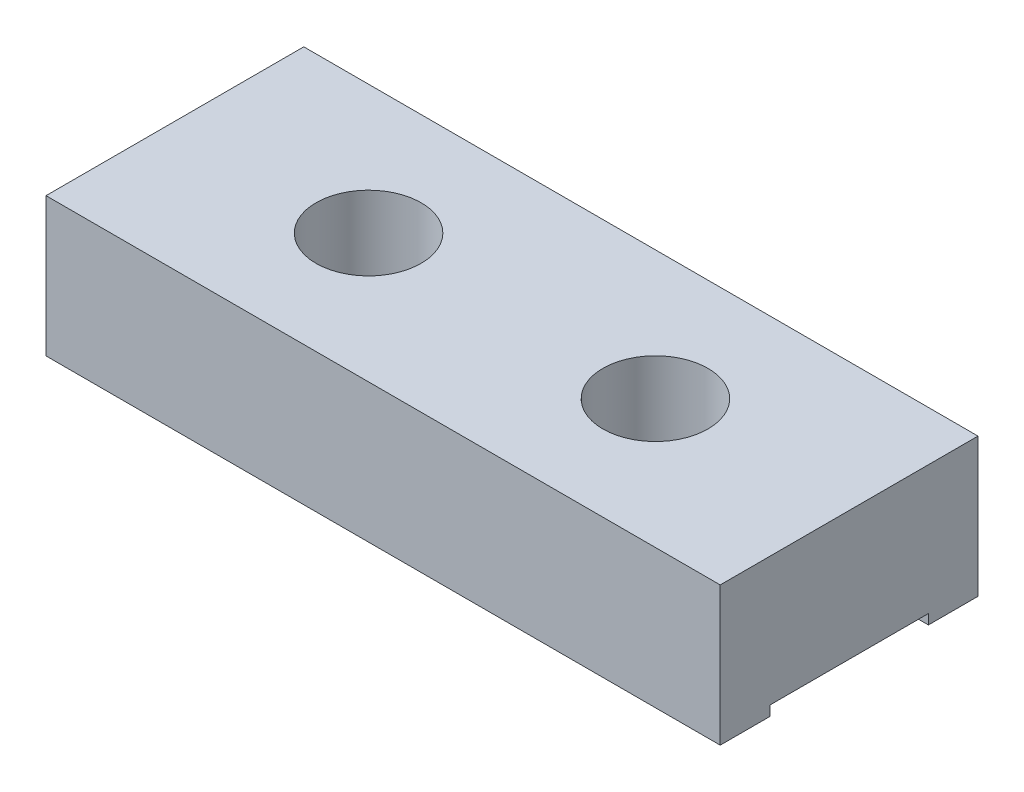
ISO-10303-21;
HEADER;
FILE_DESCRIPTION(('STEP AP214'),'2;1');
FILE_NAME('part.step','',(''),(''),'','','');
FILE_SCHEMA(('AUTOMOTIVE_DESIGN { 1 0 10303 214 1 1 1 1 }'));
ENDSEC;
DATA;
#1=APPLICATION_CONTEXT('core data for automotive mechanical design processes');
#2=APPLICATION_PROTOCOL_DEFINITION('international standard','automotive_design',2000,#1);
#3=PRODUCT_CONTEXT('',#1,'mechanical');
#4=PRODUCT('Part','Part','',(#3));
#5=PRODUCT_RELATED_PRODUCT_CATEGORY('part','',(#4));
#6=PRODUCT_DEFINITION_FORMATION('','',#4);
#7=PRODUCT_DEFINITION_CONTEXT('part definition',#1,'design');
#8=PRODUCT_DEFINITION('design','',#6,#7);
#9=PRODUCT_DEFINITION_SHAPE('','',#8);
#10=(LENGTH_UNIT() NAMED_UNIT(*) SI_UNIT(.MILLI.,.METRE.));
#11=(NAMED_UNIT(*) PLANE_ANGLE_UNIT() SI_UNIT($,.RADIAN.));
#12=(NAMED_UNIT(*) SI_UNIT($,.STERADIAN.) SOLID_ANGLE_UNIT());
#13=UNCERTAINTY_MEASURE_WITH_UNIT(LENGTH_MEASURE(1.E-05),#10,'distance_accuracy_value','');
#14=(GEOMETRIC_REPRESENTATION_CONTEXT(3) GLOBAL_UNCERTAINTY_ASSIGNED_CONTEXT((#13)) GLOBAL_UNIT_ASSIGNED_CONTEXT((#10,
#11,#12)) REPRESENTATION_CONTEXT('',''));
#15=CARTESIAN_POINT('',(0.,0.,0.));
#16=DIRECTION('',(0.,0.,1.));
#17=DIRECTION('',(1.,0.,0.));
#18=AXIS2_PLACEMENT_3D('',#15,#16,#17);
#19=CARTESIAN_POINT('',(31.7648230602334,7.5,4.));
#20=DIRECTION('',(0.,0.,1.));
#21=DIRECTION('',(1.,0.,0.));
#22=AXIS2_PLACEMENT_3D('',#19,#20,#21);
#23=PLANE('',#22);
#24=DIRECTION('',(0.,1.,0.));
#25=VECTOR('',#24,1.);
#26=CARTESIAN_POINT('',(17.,7.5,4.));
#27=LINE('',#26,#25);
#28=CARTESIAN_POINT('',(17.,0.5,4.));
#29=VERTEX_POINT('',#28);
#30=CARTESIAN_POINT('',(17.,7.5,4.));
#31=VERTEX_POINT('',#30);
#32=EDGE_CURVE('E132',#29,#31,#27,.T.);
#33=ORIENTED_EDGE('',*,*,#32,.F.);
#34=DIRECTION('',(-1.,0.,0.));
#35=VECTOR('',#34,1.);
#36=CARTESIAN_POINT('',(31.7648230602334,0.5,4.));
#37=LINE('',#36,#35);
#38=CARTESIAN_POINT('',(-17.,0.5,4.));
#39=VERTEX_POINT('',#38);
#40=EDGE_CURVE('E67',#29,#39,#37,.T.);
#41=ORIENTED_EDGE('',*,*,#40,.T.);
#42=DIRECTION('',(0.,1.,0.));
#43=VECTOR('',#42,1.);
#44=CARTESIAN_POINT('',(-17.,7.5,4.));
#45=LINE('',#44,#43);
#46=CARTESIAN_POINT('',(-17.,7.5,4.00000000000001));
#47=VERTEX_POINT('',#46);
#48=EDGE_CURVE('E149',#39,#47,#45,.T.);
#49=ORIENTED_EDGE('',*,*,#48,.T.);
#50=DIRECTION('',(-1.,0.,0.));
#51=VECTOR('',#50,1.);
#52=CARTESIAN_POINT('',(31.7648230602334,7.5,4.));
#53=LINE('',#52,#51);
#54=EDGE_CURVE('E137',#31,#47,#53,.T.);
#55=ORIENTED_EDGE('',*,*,#54,.F.);
#56=EDGE_LOOP('',(#33,#41,#49,#55));
#57=FACE_BOUND('',#56,.T.);
#58=ADVANCED_FACE('F50',(#57),#23,.F.);
#59=CARTESIAN_POINT('',(31.7648230602334,7.5,17.));
#60=DIRECTION('',(0.,-1.,0.));
#61=DIRECTION('',(0.,0.,-1.));
#62=AXIS2_PLACEMENT_3D('',#59,#60,#61);
#63=PLANE('',#62);
#64=CARTESIAN_POINT('',(-7.23273807074473,7.5,10.5));
#65=DIRECTION('',(0.,1.,0.));
#66=DIRECTION('',(0.,0.,1.));
#67=AXIS2_PLACEMENT_3D('',#64,#65,#66);
#68=CIRCLE('',#67,2.64999999999999);
#69=CARTESIAN_POINT('',(-7.23273807074473,7.5,13.15));
#70=VERTEX_POINT('',#69);
#71=EDGE_CURVE('E164',#70,#70,#68,.T.);
#72=ORIENTED_EDGE('',*,*,#71,.F.);
#73=EDGE_LOOP('',(#72));
#74=FACE_BOUND('',#73,.T.);
#75=CARTESIAN_POINT('',(7.23273807074473,7.5,10.5));
#76=DIRECTION('',(0.,1.,0.));
#77=DIRECTION('',(0.,0.,1.));
#78=AXIS2_PLACEMENT_3D('',#75,#76,#77);
#79=CIRCLE('',#78,2.64999999999999);
#80=CARTESIAN_POINT('',(7.23273807074473,7.5,13.15));
#81=VERTEX_POINT('',#80);
#82=EDGE_CURVE('E153',#81,#81,#79,.T.);
#83=ORIENTED_EDGE('',*,*,#82,.F.);
#84=EDGE_LOOP('',(#83));
#85=FACE_BOUND('',#84,.T.);
#86=DIRECTION('',(0.,0.,1.));
#87=VECTOR('',#86,1.);
#88=CARTESIAN_POINT('',(17.,7.5,17.));
#89=LINE('',#88,#87);
#90=CARTESIAN_POINT('',(17.,7.5,17.));
#91=VERTEX_POINT('',#90);
#92=EDGE_CURVE('E129',#31,#91,#89,.T.);
#93=ORIENTED_EDGE('',*,*,#92,.F.);
#94=ORIENTED_EDGE('',*,*,#54,.T.);
#95=DIRECTION('',(0.,0.,1.));
#96=VECTOR('',#95,1.);
#97=CARTESIAN_POINT('',(-17.,7.5,17.));
#98=LINE('',#97,#96);
#99=CARTESIAN_POINT('',(-17.,7.5,17.));
#100=VERTEX_POINT('',#99);
#101=EDGE_CURVE('E152',#47,#100,#98,.T.);
#102=ORIENTED_EDGE('',*,*,#101,.T.);
#103=DIRECTION('',(-1.,0.,0.));
#104=VECTOR('',#103,1.);
#105=CARTESIAN_POINT('',(31.7648230602334,7.5,17.));
#106=LINE('',#105,#104);
#107=EDGE_CURVE('E140',#91,#100,#106,.T.);
#108=ORIENTED_EDGE('',*,*,#107,.F.);
#109=EDGE_LOOP('',(#93,#94,#102,#108));
#110=FACE_BOUND('',#109,.T.);
#111=ADVANCED_FACE('F195',(#74,#85,#110),#63,.F.);
#112=CARTESIAN_POINT('',(31.7648230602334,7.5,17.));
#113=DIRECTION('',(0.,0.,-1.));
#114=DIRECTION('',(0.,1.,0.));
#115=AXIS2_PLACEMENT_3D('',#112,#113,#114);
#116=PLANE('',#115);
#117=DIRECTION('',(0.,-1.,0.));
#118=VECTOR('',#117,1.);
#119=CARTESIAN_POINT('',(17.,7.5,17.));
#120=LINE('',#119,#118);
#121=CARTESIAN_POINT('',(17.,0.5,17.));
#122=VERTEX_POINT('',#121);
#123=EDGE_CURVE('E125',#91,#122,#120,.T.);
#124=ORIENTED_EDGE('',*,*,#123,.F.);
#125=ORIENTED_EDGE('',*,*,#107,.T.);
#126=DIRECTION('',(0.,-1.,0.));
#127=VECTOR('',#126,1.);
#128=CARTESIAN_POINT('',(-17.,7.5,17.));
#129=LINE('',#128,#127);
#130=CARTESIAN_POINT('',(-17.,0.5,17.));
#131=VERTEX_POINT('',#130);
#132=EDGE_CURVE('E157',#100,#131,#129,.T.);
#133=ORIENTED_EDGE('',*,*,#132,.T.);
#134=DIRECTION('',(-1.,0.,0.));
#135=VECTOR('',#134,1.);
#136=CARTESIAN_POINT('',(31.7648230602334,0.5,17.));
#137=LINE('',#136,#135);
#138=EDGE_CURVE('E143',#122,#131,#137,.T.);
#139=ORIENTED_EDGE('',*,*,#138,.F.);
#140=EDGE_LOOP('',(#124,#125,#133,#139));
#141=FACE_BOUND('',#140,.T.);
#142=ADVANCED_FACE('F184',(#141),#116,.F.);
#143=CARTESIAN_POINT('',(31.7648230602334,0.5,14.5));
#144=DIRECTION('',(0.,1.,0.));
#145=DIRECTION('',(0.,0.,1.));
#146=AXIS2_PLACEMENT_3D('',#143,#144,#145);
#147=PLANE('',#146);
#148=DIRECTION('',(0.,0.,-1.));
#149=VECTOR('',#148,1.);
#150=CARTESIAN_POINT('',(17.,0.5,14.5));
#151=LINE('',#150,#149);
#152=CARTESIAN_POINT('',(17.,0.5,14.5));
#153=VERTEX_POINT('',#152);
#154=EDGE_CURVE('E123',#122,#153,#151,.T.);
#155=ORIENTED_EDGE('',*,*,#154,.F.);
#156=ORIENTED_EDGE('',*,*,#138,.T.);
#157=DIRECTION('',(0.,0.,-1.));
#158=VECTOR('',#157,1.);
#159=CARTESIAN_POINT('',(-17.,0.5,14.5));
#160=LINE('',#159,#158);
#161=CARTESIAN_POINT('',(-17.,0.5,14.5));
#162=VERTEX_POINT('',#161);
#163=EDGE_CURVE('E176',#131,#162,#160,.T.);
#164=ORIENTED_EDGE('',*,*,#163,.T.);
#165=DIRECTION('',(-1.,0.,0.));
#166=VECTOR('',#165,1.);
#167=CARTESIAN_POINT('',(31.7648230602334,0.5,14.5));
#168=LINE('',#167,#166);
#169=EDGE_CURVE('E118',#153,#162,#168,.T.);
#170=ORIENTED_EDGE('',*,*,#169,.F.);
#171=EDGE_LOOP('',(#155,#156,#164,#170));
#172=FACE_BOUND('',#171,.T.);
#173=ADVANCED_FACE('F211',(#172),#147,.F.);
#174=CARTESIAN_POINT('',(31.7648230602334,1.,14.5));
#175=DIRECTION('',(0.,0.,1.));
#176=DIRECTION('',(1.,0.,0.));
#177=AXIS2_PLACEMENT_3D('',#174,#175,#176);
#178=PLANE('',#177);
#179=DIRECTION('',(0.,1.,0.));
#180=VECTOR('',#179,1.);
#181=CARTESIAN_POINT('',(17.,1.,14.5));
#182=LINE('',#181,#180);
#183=CARTESIAN_POINT('',(17.,1.,14.5));
#184=VERTEX_POINT('',#183);
#185=EDGE_CURVE('E109',#153,#184,#182,.T.);
#186=ORIENTED_EDGE('',*,*,#185,.F.);
#187=ORIENTED_EDGE('',*,*,#169,.T.);
#188=DIRECTION('',(0.,1.,0.));
#189=VECTOR('',#188,1.);
#190=CARTESIAN_POINT('',(-17.,1.,14.5));
#191=LINE('',#190,#189);
#192=CARTESIAN_POINT('',(-17.,1.,14.5));
#193=VERTEX_POINT('',#192);
#194=EDGE_CURVE('E117',#162,#193,#191,.T.);
#195=ORIENTED_EDGE('',*,*,#194,.T.);
#196=DIRECTION('',(-1.,0.,0.));
#197=VECTOR('',#196,1.);
#198=CARTESIAN_POINT('',(31.7648230602334,1.,14.5));
#199=LINE('',#198,#197);
#200=EDGE_CURVE('E103',#184,#193,#199,.T.);
#201=ORIENTED_EDGE('',*,*,#200,.F.);
#202=EDGE_LOOP('',(#186,#187,#195,#201));
#203=FACE_BOUND('',#202,.T.);
#204=ADVANCED_FACE('F113',(#203),#178,.F.);
#205=CARTESIAN_POINT('',(31.7648230602334,1.,14.5));
#206=DIRECTION('',(0.,1.,0.));
#207=DIRECTION('',(0.,0.,1.));
#208=AXIS2_PLACEMENT_3D('',#205,#206,#207);
#209=PLANE('',#208);
#210=CARTESIAN_POINT('',(-7.23273807074473,1.,10.5));
#211=DIRECTION('',(0.,1.,0.));
#212=DIRECTION('',(0.,0.,1.));
#213=AXIS2_PLACEMENT_3D('',#210,#211,#212);
#214=CIRCLE('',#213,2.64999999999999);
#215=CARTESIAN_POINT('',(-7.23273807074473,1.,13.15));
#216=VERTEX_POINT('',#215);
#217=EDGE_CURVE('E54',#216,#216,#214,.T.);
#218=ORIENTED_EDGE('',*,*,#217,.T.);
#219=EDGE_LOOP('',(#218));
#220=FACE_BOUND('',#219,.T.);
#221=CARTESIAN_POINT('',(7.23273807074473,1.,10.5));
#222=DIRECTION('',(0.,1.,0.));
#223=DIRECTION('',(0.,0.,1.));
#224=AXIS2_PLACEMENT_3D('',#221,#222,#223);
#225=CIRCLE('',#224,2.64999999999999);
#226=CARTESIAN_POINT('',(7.23273807074473,1.,13.15));
#227=VERTEX_POINT('',#226);
#228=EDGE_CURVE('E150',#227,#227,#225,.T.);
#229=ORIENTED_EDGE('',*,*,#228,.T.);
#230=EDGE_LOOP('',(#229));
#231=FACE_BOUND('',#230,.T.);
#232=DIRECTION('',(0.,0.,-1.));
#233=VECTOR('',#232,1.);
#234=CARTESIAN_POINT('',(17.,1.,14.5));
#235=LINE('',#234,#233);
#236=CARTESIAN_POINT('',(17.,1.,6.5));
#237=VERTEX_POINT('',#236);
#238=EDGE_CURVE('E59',#184,#237,#235,.T.);
#239=ORIENTED_EDGE('',*,*,#238,.F.);
#240=ORIENTED_EDGE('',*,*,#200,.T.);
#241=DIRECTION('',(0.,0.,-1.));
#242=VECTOR('',#241,1.);
#243=CARTESIAN_POINT('',(-17.,1.,14.5));
#244=LINE('',#243,#242);
#245=CARTESIAN_POINT('',(-17.,1.,6.5));
#246=VERTEX_POINT('',#245);
#247=EDGE_CURVE('E173',#193,#246,#244,.T.);
#248=ORIENTED_EDGE('',*,*,#247,.T.);
#249=DIRECTION('',(-1.,0.,0.));
#250=VECTOR('',#249,1.);
#251=CARTESIAN_POINT('',(31.7648230602334,1.,6.5));
#252=LINE('',#251,#250);
#253=EDGE_CURVE('E106',#237,#246,#252,.T.);
#254=ORIENTED_EDGE('',*,*,#253,.F.);
#255=EDGE_LOOP('',(#239,#240,#248,#254));
#256=FACE_BOUND('',#255,.T.);
#257=ADVANCED_FACE('F100',(#220,#231,#256),#209,.F.);
#258=CARTESIAN_POINT('',(31.7648230602334,1.,6.5));
#259=DIRECTION('',(0.,0.,-1.));
#260=DIRECTION('',(-1.,0.,0.));
#261=AXIS2_PLACEMENT_3D('',#258,#259,#260);
#262=PLANE('',#261);
#263=DIRECTION('',(0.,-1.,0.));
#264=VECTOR('',#263,1.);
#265=CARTESIAN_POINT('',(17.,1.,6.5));
#266=LINE('',#265,#264);
#267=CARTESIAN_POINT('',(17.,0.5,6.5));
#268=VERTEX_POINT('',#267);
#269=EDGE_CURVE('E12',#237,#268,#266,.T.);
#270=ORIENTED_EDGE('',*,*,#269,.F.);
#271=ORIENTED_EDGE('',*,*,#253,.T.);
#272=DIRECTION('',(0.,-1.,0.));
#273=VECTOR('',#272,1.);
#274=CARTESIAN_POINT('',(-17.,1.,6.5));
#275=LINE('',#274,#273);
#276=CARTESIAN_POINT('',(-17.,0.5,6.5));
#277=VERTEX_POINT('',#276);
#278=EDGE_CURVE('E171',#246,#277,#275,.T.);
#279=ORIENTED_EDGE('',*,*,#278,.T.);
#280=DIRECTION('',(-1.,0.,0.));
#281=VECTOR('',#280,1.);
#282=CARTESIAN_POINT('',(31.7648230602334,0.5,6.5));
#283=LINE('',#282,#281);
#284=EDGE_CURVE('E76',#268,#277,#283,.T.);
#285=ORIENTED_EDGE('',*,*,#284,.F.);
#286=EDGE_LOOP('',(#270,#271,#279,#285));
#287=FACE_BOUND('',#286,.T.);
#288=ADVANCED_FACE('F205',(#287),#262,.F.);
#289=CARTESIAN_POINT('',(31.7648230602334,0.5,4.));
#290=DIRECTION('',(0.,1.,0.));
#291=DIRECTION('',(0.,0.,1.));
#292=AXIS2_PLACEMENT_3D('',#289,#290,#291);
#293=PLANE('',#292);
#294=DIRECTION('',(0.,0.,-1.));
#295=VECTOR('',#294,1.);
#296=CARTESIAN_POINT('',(17.,0.5,4.));
#297=LINE('',#296,#295);
#298=EDGE_CURVE('E135',#268,#29,#297,.T.);
#299=ORIENTED_EDGE('',*,*,#298,.F.);
#300=ORIENTED_EDGE('',*,*,#284,.T.);
#301=DIRECTION('',(0.,0.,-1.));
#302=VECTOR('',#301,1.);
#303=CARTESIAN_POINT('',(-17.,0.5,4.00000000000001));
#304=LINE('',#303,#302);
#305=EDGE_CURVE('E169',#277,#39,#304,.T.);
#306=ORIENTED_EDGE('',*,*,#305,.T.);
#307=ORIENTED_EDGE('',*,*,#40,.F.);
#308=EDGE_LOOP('',(#299,#300,#306,#307));
#309=FACE_BOUND('',#308,.T.);
#310=ADVANCED_FACE('F198',(#309),#293,.F.);
#311=CARTESIAN_POINT('',(17.,-0.5,17.));
#312=DIRECTION('',(1.,0.,0.));
#313=DIRECTION('',(0.,0.,-1.));
#314=AXIS2_PLACEMENT_3D('',#311,#312,#313);
#315=PLANE('',#314);
#316=ORIENTED_EDGE('',*,*,#298,.T.);
#317=ORIENTED_EDGE('',*,*,#32,.T.);
#318=ORIENTED_EDGE('',*,*,#92,.T.);
#319=ORIENTED_EDGE('',*,*,#123,.T.);
#320=ORIENTED_EDGE('',*,*,#154,.T.);
#321=ORIENTED_EDGE('',*,*,#185,.T.);
#322=ORIENTED_EDGE('',*,*,#238,.T.);
#323=ORIENTED_EDGE('',*,*,#269,.T.);
#324=EDGE_LOOP('',(#316,#317,#318,#319,#320,#321,#322,#323));
#325=FACE_BOUND('',#324,.T.);
#326=ADVANCED_FACE('F52',(#325),#315,.T.);
#327=CARTESIAN_POINT('',(-17.,-0.5,17.));
#328=DIRECTION('',(-1.,0.,0.));
#329=DIRECTION('',(0.,0.,1.));
#330=AXIS2_PLACEMENT_3D('',#327,#328,#329);
#331=PLANE('',#330);
#332=ORIENTED_EDGE('',*,*,#48,.F.);
#333=ORIENTED_EDGE('',*,*,#305,.F.);
#334=ORIENTED_EDGE('',*,*,#278,.F.);
#335=ORIENTED_EDGE('',*,*,#247,.F.);
#336=ORIENTED_EDGE('',*,*,#194,.F.);
#337=ORIENTED_EDGE('',*,*,#163,.F.);
#338=ORIENTED_EDGE('',*,*,#132,.F.);
#339=ORIENTED_EDGE('',*,*,#101,.F.);
#340=EDGE_LOOP('',(#332,#333,#334,#335,#336,#337,#338,#339));
#341=FACE_BOUND('',#340,.T.);
#342=ADVANCED_FACE('F192',(#341),#331,.T.);
#343=CARTESIAN_POINT('',(7.23273807074473,7.5,10.5));
#344=DIRECTION('',(0.,1.,0.));
#345=DIRECTION('',(0.,0.,1.));
#346=AXIS2_PLACEMENT_3D('',#343,#344,#345);
#347=CYLINDRICAL_SURFACE('',#346,2.64999999999999);
#348=ORIENTED_EDGE('',*,*,#82,.T.);
#349=EDGE_LOOP('',(#348));
#350=FACE_BOUND('',#349,.T.);
#351=ORIENTED_EDGE('',*,*,#228,.F.);
#352=EDGE_LOOP('',(#351));
#353=FACE_BOUND('',#352,.T.);
#354=ADVANCED_FACE('F237',(#350,#353),#347,.F.);
#355=CARTESIAN_POINT('',(-7.23273807074473,7.5,10.5));
#356=DIRECTION('',(0.,1.,0.));
#357=DIRECTION('',(0.,0.,1.));
#358=AXIS2_PLACEMENT_3D('',#355,#356,#357);
#359=CYLINDRICAL_SURFACE('',#358,2.64999999999999);
#360=ORIENTED_EDGE('',*,*,#71,.T.);
#361=EDGE_LOOP('',(#360));
#362=FACE_BOUND('',#361,.T.);
#363=ORIENTED_EDGE('',*,*,#217,.F.);
#364=EDGE_LOOP('',(#363));
#365=FACE_BOUND('',#364,.T.);
#366=ADVANCED_FACE('F234',(#362,#365),#359,.F.);
#367=CLOSED_SHELL('',(#58,#111,#142,#173,#204,#257,#288,#310,#326,#342,#354,#366));
#368=MANIFOLD_SOLID_BREP('B2',#367);
#369=ADVANCED_BREP_SHAPE_REPRESENTATION('',(#18,#368),#14);
#370=SHAPE_DEFINITION_REPRESENTATION(#9,#369);
ENDSEC;
END-ISO-10303-21;
